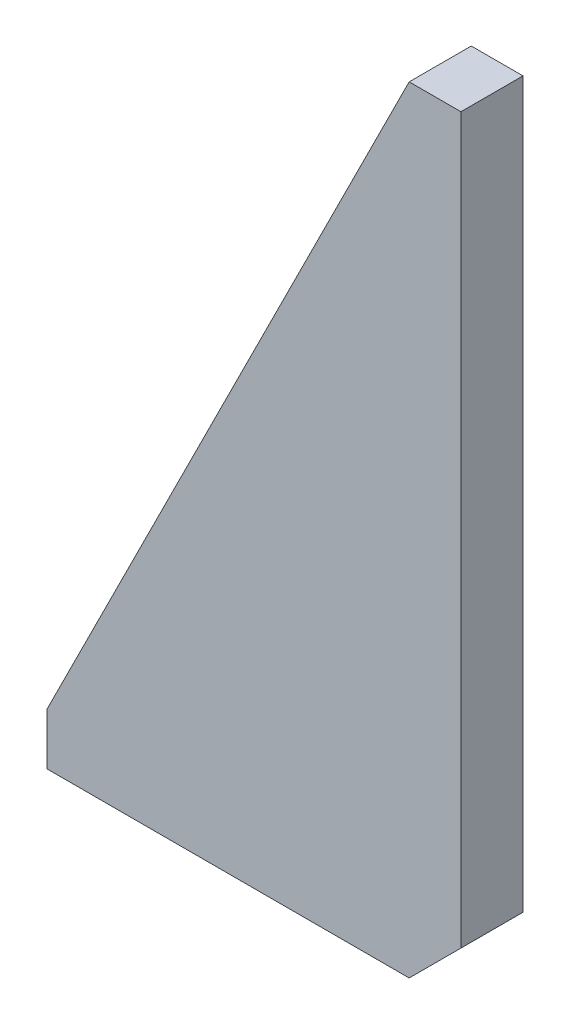
ISO-10303-21;
HEADER;
FILE_DESCRIPTION(('STEP AP214'),'2;1');
FILE_NAME('part.step','',(''),(''),'','','');
FILE_SCHEMA(('AUTOMOTIVE_DESIGN { 1 0 10303 214 1 1 1 1 }'));
ENDSEC;
DATA;
#1=APPLICATION_CONTEXT('core data for automotive mechanical design processes');
#2=APPLICATION_PROTOCOL_DEFINITION('international standard','automotive_design',2000,#1);
#3=PRODUCT_CONTEXT('',#1,'mechanical');
#4=PRODUCT('Part','Part','',(#3));
#5=PRODUCT_RELATED_PRODUCT_CATEGORY('part','',(#4));
#6=PRODUCT_DEFINITION_FORMATION('','',#4);
#7=PRODUCT_DEFINITION_CONTEXT('part definition',#1,'design');
#8=PRODUCT_DEFINITION('design','',#6,#7);
#9=PRODUCT_DEFINITION_SHAPE('','',#8);
#10=(LENGTH_UNIT() NAMED_UNIT(*) SI_UNIT(.MILLI.,.METRE.));
#11=(NAMED_UNIT(*) PLANE_ANGLE_UNIT() SI_UNIT($,.RADIAN.));
#12=(NAMED_UNIT(*) SI_UNIT($,.STERADIAN.) SOLID_ANGLE_UNIT());
#13=UNCERTAINTY_MEASURE_WITH_UNIT(LENGTH_MEASURE(1.E-05),#10,'distance_accuracy_value','');
#14=(GEOMETRIC_REPRESENTATION_CONTEXT(3) GLOBAL_UNCERTAINTY_ASSIGNED_CONTEXT((#13)) GLOBAL_UNIT_ASSIGNED_CONTEXT((#10,
#11,#12)) REPRESENTATION_CONTEXT('',''));
#15=CARTESIAN_POINT('',(0.,0.,0.));
#16=DIRECTION('',(0.,0.,1.));
#17=DIRECTION('',(1.,0.,0.));
#18=AXIS2_PLACEMENT_3D('',#15,#16,#17);
#19=CARTESIAN_POINT('',(-80.,10.,12.));
#20=DIRECTION('',(1.,0.,0.));
#21=DIRECTION('',(0.,0.,-1.));
#22=AXIS2_PLACEMENT_3D('',#19,#20,#21);
#23=PLANE('',#22);
#24=DIRECTION('',(0.,-1.,0.));
#25=VECTOR('',#24,1.);
#26=CARTESIAN_POINT('',(-80.,10.,0.));
#27=LINE('',#26,#25);
#28=CARTESIAN_POINT('',(-80.,10.,0.));
#29=VERTEX_POINT('',#28);
#30=CARTESIAN_POINT('',(-80.,0.,0.));
#31=VERTEX_POINT('',#30);
#32=EDGE_CURVE('E118',#29,#31,#27,.T.);
#33=ORIENTED_EDGE('',*,*,#32,.T.);
#34=DIRECTION('',(0.,0.,-1.));
#35=VECTOR('',#34,1.);
#36=CARTESIAN_POINT('',(-80.,0.,12.));
#37=LINE('',#36,#35);
#38=CARTESIAN_POINT('',(-80.,0.,12.));
#39=VERTEX_POINT('',#38);
#40=EDGE_CURVE('E11',#39,#31,#37,.T.);
#41=ORIENTED_EDGE('',*,*,#40,.F.);
#42=DIRECTION('',(0.,-1.,0.));
#43=VECTOR('',#42,1.);
#44=CARTESIAN_POINT('',(-80.,10.,12.));
#45=LINE('',#44,#43);
#46=CARTESIAN_POINT('',(-80.,10.,12.));
#47=VERTEX_POINT('',#46);
#48=EDGE_CURVE('E128',#47,#39,#45,.T.);
#49=ORIENTED_EDGE('',*,*,#48,.F.);
#50=DIRECTION('',(0.,0.,-1.));
#51=VECTOR('',#50,1.);
#52=CARTESIAN_POINT('',(-80.,10.,12.));
#53=LINE('',#52,#51);
#54=EDGE_CURVE('E114',#47,#29,#53,.T.);
#55=ORIENTED_EDGE('',*,*,#54,.T.);
#56=EDGE_LOOP('',(#33,#41,#49,#55));
#57=FACE_BOUND('',#56,.T.);
#58=ADVANCED_FACE('F34',(#57),#23,.F.);
#59=CARTESIAN_POINT('',(-80.,0.,12.));
#60=DIRECTION('',(0.,1.,0.));
#61=DIRECTION('',(0.,0.,1.));
#62=AXIS2_PLACEMENT_3D('',#59,#60,#61);
#63=PLANE('',#62);
#64=DIRECTION('',(1.,0.,0.));
#65=VECTOR('',#64,1.);
#66=CARTESIAN_POINT('',(-80.,0.,0.));
#67=LINE('',#66,#65);
#68=CARTESIAN_POINT('',(-10.,0.,0.));
#69=VERTEX_POINT('',#68);
#70=EDGE_CURVE('E121',#31,#69,#67,.T.);
#71=ORIENTED_EDGE('',*,*,#70,.T.);
#72=DIRECTION('',(0.,0.,-1.));
#73=VECTOR('',#72,1.);
#74=CARTESIAN_POINT('',(-10.,0.,12.));
#75=LINE('',#74,#73);
#76=CARTESIAN_POINT('',(-10.,0.,12.));
#77=VERTEX_POINT('',#76);
#78=EDGE_CURVE('E42',#77,#69,#75,.T.);
#79=ORIENTED_EDGE('',*,*,#78,.F.);
#80=DIRECTION('',(1.,0.,0.));
#81=VECTOR('',#80,1.);
#82=CARTESIAN_POINT('',(-80.,0.,12.));
#83=LINE('',#82,#81);
#84=EDGE_CURVE('E87',#39,#77,#83,.T.);
#85=ORIENTED_EDGE('',*,*,#84,.F.);
#86=ORIENTED_EDGE('',*,*,#40,.T.);
#87=EDGE_LOOP('',(#71,#79,#85,#86));
#88=FACE_BOUND('',#87,.T.);
#89=ADVANCED_FACE('F152',(#88),#63,.F.);
#90=CARTESIAN_POINT('',(-10.,0.,12.));
#91=DIRECTION('',(-0.707106781186547,0.707106781186547,0.));
#92=DIRECTION('',(-0.707106781186548,-0.707106781186548,0.));
#93=AXIS2_PLACEMENT_3D('',#90,#91,#92);
#94=PLANE('',#93);
#95=DIRECTION('',(0.707106781186548,0.707106781186548,0.));
#96=VECTOR('',#95,1.);
#97=CARTESIAN_POINT('',(-10.,0.,0.));
#98=LINE('',#97,#96);
#99=CARTESIAN_POINT('',(0.,10.,0.));
#100=VERTEX_POINT('',#99);
#101=EDGE_CURVE('E123',#69,#100,#98,.T.);
#102=ORIENTED_EDGE('',*,*,#101,.T.);
#103=DIRECTION('',(0.,0.,-1.));
#104=VECTOR('',#103,1.);
#105=CARTESIAN_POINT('',(0.,10.,12.));
#106=LINE('',#105,#104);
#107=CARTESIAN_POINT('',(0.,10.,12.));
#108=VERTEX_POINT('',#107);
#109=EDGE_CURVE('E109',#108,#100,#106,.T.);
#110=ORIENTED_EDGE('',*,*,#109,.F.);
#111=DIRECTION('',(0.707106781186548,0.707106781186548,0.));
#112=VECTOR('',#111,1.);
#113=CARTESIAN_POINT('',(-10.,0.,12.));
#114=LINE('',#113,#112);
#115=EDGE_CURVE('E100',#77,#108,#114,.T.);
#116=ORIENTED_EDGE('',*,*,#115,.F.);
#117=ORIENTED_EDGE('',*,*,#78,.T.);
#118=EDGE_LOOP('',(#102,#110,#116,#117));
#119=FACE_BOUND('',#118,.T.);
#120=ADVANCED_FACE('F134',(#119),#94,.F.);
#121=CARTESIAN_POINT('',(0.,10.,12.));
#122=DIRECTION('',(-1.,0.,0.));
#123=DIRECTION('',(0.,0.,1.));
#124=AXIS2_PLACEMENT_3D('',#121,#122,#123);
#125=PLANE('',#124);
#126=DIRECTION('',(0.,1.,0.));
#127=VECTOR('',#126,1.);
#128=CARTESIAN_POINT('',(0.,10.,0.));
#129=LINE('',#128,#127);
#130=CARTESIAN_POINT('',(0.,150.,0.));
#131=VERTEX_POINT('',#130);
#132=EDGE_CURVE('E108',#100,#131,#129,.T.);
#133=ORIENTED_EDGE('',*,*,#132,.T.);
#134=DIRECTION('',(0.,0.,-1.));
#135=VECTOR('',#134,1.);
#136=CARTESIAN_POINT('',(0.,150.,12.));
#137=LINE('',#136,#135);
#138=CARTESIAN_POINT('',(0.,150.,12.));
#139=VERTEX_POINT('',#138);
#140=EDGE_CURVE('E105',#139,#131,#137,.T.);
#141=ORIENTED_EDGE('',*,*,#140,.F.);
#142=DIRECTION('',(0.,1.,0.));
#143=VECTOR('',#142,1.);
#144=CARTESIAN_POINT('',(0.,10.,12.));
#145=LINE('',#144,#143);
#146=EDGE_CURVE('E94',#108,#139,#145,.T.);
#147=ORIENTED_EDGE('',*,*,#146,.F.);
#148=ORIENTED_EDGE('',*,*,#109,.T.);
#149=EDGE_LOOP('',(#133,#141,#147,#148));
#150=FACE_BOUND('',#149,.T.);
#151=ADVANCED_FACE('F106',(#150),#125,.F.);
#152=CARTESIAN_POINT('',(0.,150.,12.));
#153=DIRECTION('',(0.,-1.,0.));
#154=DIRECTION('',(1.,0.,0.));
#155=AXIS2_PLACEMENT_3D('',#152,#153,#154);
#156=PLANE('',#155);
#157=DIRECTION('',(-1.,0.,0.));
#158=VECTOR('',#157,1.);
#159=CARTESIAN_POINT('',(0.,150.,0.));
#160=LINE('',#159,#158);
#161=CARTESIAN_POINT('',(-10.,150.,0.));
#162=VERTEX_POINT('',#161);
#163=EDGE_CURVE('E73',#131,#162,#160,.T.);
#164=ORIENTED_EDGE('',*,*,#163,.T.);
#165=DIRECTION('',(0.,0.,-1.));
#166=VECTOR('',#165,1.);
#167=CARTESIAN_POINT('',(-10.,150.,12.));
#168=LINE('',#167,#166);
#169=CARTESIAN_POINT('',(-10.,150.,12.));
#170=VERTEX_POINT('',#169);
#171=EDGE_CURVE('E110',#170,#162,#168,.T.);
#172=ORIENTED_EDGE('',*,*,#171,.F.);
#173=DIRECTION('',(-1.,0.,0.));
#174=VECTOR('',#173,1.);
#175=CARTESIAN_POINT('',(0.,150.,12.));
#176=LINE('',#175,#174);
#177=EDGE_CURVE('E98',#139,#170,#176,.T.);
#178=ORIENTED_EDGE('',*,*,#177,.F.);
#179=ORIENTED_EDGE('',*,*,#140,.T.);
#180=EDGE_LOOP('',(#164,#172,#178,#179));
#181=FACE_BOUND('',#180,.T.);
#182=ADVANCED_FACE('F112',(#181),#156,.F.);
#183=CARTESIAN_POINT('',(-10.,150.,12.));
#184=DIRECTION('',(0.894427190999916,-0.447213595499958,0.));
#185=DIRECTION('',(0.447213595499958,0.894427190999916,0.));
#186=AXIS2_PLACEMENT_3D('',#183,#184,#185);
#187=PLANE('',#186);
#188=DIRECTION('',(-0.447213595499958,-0.894427190999916,0.));
#189=VECTOR('',#188,1.);
#190=CARTESIAN_POINT('',(-10.,150.,0.));
#191=LINE('',#190,#189);
#192=EDGE_CURVE('E79',#162,#29,#191,.T.);
#193=ORIENTED_EDGE('',*,*,#192,.T.);
#194=ORIENTED_EDGE('',*,*,#54,.F.);
#195=DIRECTION('',(-0.447213595499958,-0.894427190999916,0.));
#196=VECTOR('',#195,1.);
#197=CARTESIAN_POINT('',(-10.,150.,12.));
#198=LINE('',#197,#196);
#199=EDGE_CURVE('E50',#170,#47,#198,.T.);
#200=ORIENTED_EDGE('',*,*,#199,.F.);
#201=ORIENTED_EDGE('',*,*,#171,.T.);
#202=EDGE_LOOP('',(#193,#194,#200,#201));
#203=FACE_BOUND('',#202,.T.);
#204=ADVANCED_FACE('F141',(#203),#187,.F.);
#205=CARTESIAN_POINT('',(0.,0.,12.));
#206=DIRECTION('',(0.,0.,1.));
#207=DIRECTION('',(1.,0.,0.));
#208=AXIS2_PLACEMENT_3D('',#205,#206,#207);
#209=PLANE('',#208);
#210=ORIENTED_EDGE('',*,*,#48,.T.);
#211=ORIENTED_EDGE('',*,*,#84,.T.);
#212=ORIENTED_EDGE('',*,*,#115,.T.);
#213=ORIENTED_EDGE('',*,*,#146,.T.);
#214=ORIENTED_EDGE('',*,*,#177,.T.);
#215=ORIENTED_EDGE('',*,*,#199,.T.);
#216=EDGE_LOOP('',(#210,#211,#212,#213,#214,#215));
#217=FACE_BOUND('',#216,.T.);
#218=ADVANCED_FACE('F96',(#217),#209,.T.);
#219=CARTESIAN_POINT('',(0.,0.,0.));
#220=DIRECTION('',(0.,0.,1.));
#221=DIRECTION('',(1.,0.,0.));
#222=AXIS2_PLACEMENT_3D('',#219,#220,#221);
#223=PLANE('',#222);
#224=ORIENTED_EDGE('',*,*,#32,.F.);
#225=ORIENTED_EDGE('',*,*,#192,.F.);
#226=ORIENTED_EDGE('',*,*,#163,.F.);
#227=ORIENTED_EDGE('',*,*,#132,.F.);
#228=ORIENTED_EDGE('',*,*,#101,.F.);
#229=ORIENTED_EDGE('',*,*,#70,.F.);
#230=EDGE_LOOP('',(#224,#225,#226,#227,#228,#229));
#231=FACE_BOUND('',#230,.T.);
#232=ADVANCED_FACE('F137',(#231),#223,.F.);
#233=CLOSED_SHELL('',(#58,#89,#120,#151,#182,#204,#218,#232));
#234=MANIFOLD_SOLID_BREP('B2',#233);
#235=ADVANCED_BREP_SHAPE_REPRESENTATION('',(#18,#234),#14);
#236=SHAPE_DEFINITION_REPRESENTATION(#9,#235);
ENDSEC;
END-ISO-10303-21;
